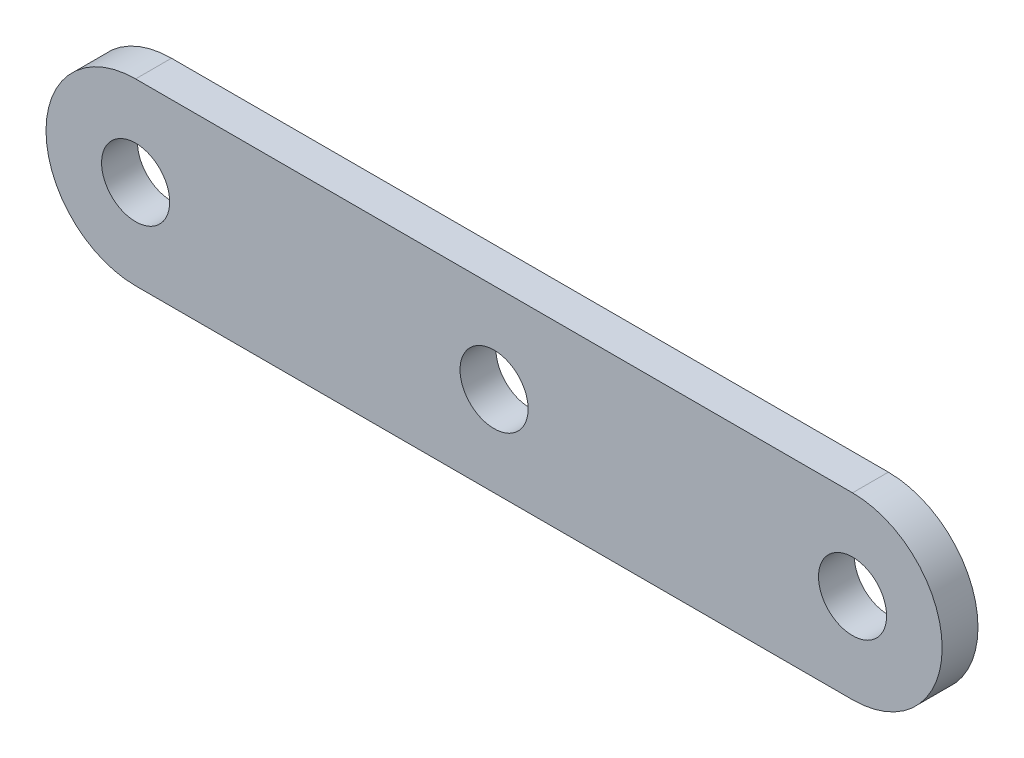
ISO-10303-21;
HEADER;
FILE_DESCRIPTION(('STEP AP214'),'2;1');
FILE_NAME('part.step','',(''),(''),'','','');
FILE_SCHEMA(('AUTOMOTIVE_DESIGN { 1 0 10303 214 1 1 1 1 }'));
ENDSEC;
DATA;
#1=APPLICATION_CONTEXT('core data for automotive mechanical design processes');
#2=APPLICATION_PROTOCOL_DEFINITION('international standard','automotive_design',2000,#1);
#3=PRODUCT_CONTEXT('',#1,'mechanical');
#4=PRODUCT('Part','Part','',(#3));
#5=PRODUCT_RELATED_PRODUCT_CATEGORY('part','',(#4));
#6=PRODUCT_DEFINITION_FORMATION('','',#4);
#7=PRODUCT_DEFINITION_CONTEXT('part definition',#1,'design');
#8=PRODUCT_DEFINITION('design','',#6,#7);
#9=PRODUCT_DEFINITION_SHAPE('','',#8);
#10=(LENGTH_UNIT() NAMED_UNIT(*) SI_UNIT(.MILLI.,.METRE.));
#11=(NAMED_UNIT(*) PLANE_ANGLE_UNIT() SI_UNIT($,.RADIAN.));
#12=(NAMED_UNIT(*) SI_UNIT($,.STERADIAN.) SOLID_ANGLE_UNIT());
#13=UNCERTAINTY_MEASURE_WITH_UNIT(LENGTH_MEASURE(1.E-05),#10,'distance_accuracy_value','');
#14=(GEOMETRIC_REPRESENTATION_CONTEXT(3) GLOBAL_UNCERTAINTY_ASSIGNED_CONTEXT((#13)) GLOBAL_UNIT_ASSIGNED_CONTEXT((#10,
#11,#12)) REPRESENTATION_CONTEXT('',''));
#15=CARTESIAN_POINT('',(0.,0.,0.));
#16=DIRECTION('',(0.,0.,1.));
#17=DIRECTION('',(1.,0.,0.));
#18=AXIS2_PLACEMENT_3D('',#15,#16,#17);
#19=CARTESIAN_POINT('',(-25.4,1.50874673629242,1.27));
#20=DIRECTION('',(0.,0.,1.));
#21=DIRECTION('',(1.,0.,0.));
#22=AXIS2_PLACEMENT_3D('',#19,#20,#21);
#23=PLANE('',#22);
#24=CARTESIAN_POINT('',(0.,1.50874673629242,1.27));
#25=DIRECTION('',(0.,0.,1.));
#26=DIRECTION('',(1.,0.,0.));
#27=AXIS2_PLACEMENT_3D('',#24,#25,#26);
#28=CIRCLE('',#27,2.413);
#29=CARTESIAN_POINT('',(2.413,1.50874673629242,1.27));
#30=VERTEX_POINT('',#29);
#31=EDGE_CURVE('E121',#30,#30,#28,.T.);
#32=ORIENTED_EDGE('',*,*,#31,.F.);
#33=EDGE_LOOP('',(#32));
#34=FACE_BOUND('',#33,.T.);
#35=CARTESIAN_POINT('',(-25.4,1.50874673629242,1.27));
#36=DIRECTION('',(0.,0.,1.));
#37=DIRECTION('',(1.,0.,0.));
#38=AXIS2_PLACEMENT_3D('',#35,#36,#37);
#39=CIRCLE('',#38,6.35);
#40=CARTESIAN_POINT('',(-25.4,7.85874673629242,1.27));
#41=VERTEX_POINT('',#40);
#42=CARTESIAN_POINT('',(-25.4,-4.84125326370757,1.27));
#43=VERTEX_POINT('',#42);
#44=EDGE_CURVE('E91',#41,#43,#39,.T.);
#45=ORIENTED_EDGE('',*,*,#44,.T.);
#46=DIRECTION('',(1.,0.,0.));
#47=VECTOR('',#46,1.);
#48=CARTESIAN_POINT('',(25.4,-4.84125326370757,1.27));
#49=LINE('',#48,#47);
#50=CARTESIAN_POINT('',(25.4,-4.84125326370757,1.27));
#51=VERTEX_POINT('',#50);
#52=EDGE_CURVE('E86',#43,#51,#49,.T.);
#53=ORIENTED_EDGE('',*,*,#52,.T.);
#54=CARTESIAN_POINT('',(25.4,1.50874673629243,1.27));
#55=DIRECTION('',(0.,0.,1.));
#56=DIRECTION('',(1.,0.,0.));
#57=AXIS2_PLACEMENT_3D('',#54,#55,#56);
#58=CIRCLE('',#57,6.35);
#59=CARTESIAN_POINT('',(25.4,7.85874673629242,1.27));
#60=VERTEX_POINT('',#59);
#61=EDGE_CURVE('E89',#51,#60,#58,.T.);
#62=ORIENTED_EDGE('',*,*,#61,.T.);
#63=DIRECTION('',(-1.,0.,0.));
#64=VECTOR('',#63,1.);
#65=CARTESIAN_POINT('',(25.4,7.85874673629242,1.27));
#66=LINE('',#65,#64);
#67=EDGE_CURVE('E56',#60,#41,#66,.T.);
#68=ORIENTED_EDGE('',*,*,#67,.T.);
#69=EDGE_LOOP('',(#45,#53,#62,#68));
#70=FACE_BOUND('',#69,.T.);
#71=CARTESIAN_POINT('',(-25.4,1.50874673629242,1.27));
#72=DIRECTION('',(0.,0.,1.));
#73=DIRECTION('',(1.,0.,0.));
#74=AXIS2_PLACEMENT_3D('',#71,#72,#73);
#75=CIRCLE('',#74,2.413);
#76=CARTESIAN_POINT('',(-22.987,1.50874673629242,1.27));
#77=VERTEX_POINT('',#76);
#78=EDGE_CURVE('E106',#77,#77,#75,.T.);
#79=ORIENTED_EDGE('',*,*,#78,.F.);
#80=EDGE_LOOP('',(#79));
#81=FACE_BOUND('',#80,.T.);
#82=CARTESIAN_POINT('',(25.4,1.50874673629243,1.27));
#83=DIRECTION('',(0.,0.,1.));
#84=DIRECTION('',(1.,0.,0.));
#85=AXIS2_PLACEMENT_3D('',#82,#83,#84);
#86=CIRCLE('',#85,2.413);
#87=CARTESIAN_POINT('',(27.813,1.50874673629243,1.27));
#88=VERTEX_POINT('',#87);
#89=EDGE_CURVE('E127',#88,#88,#86,.T.);
#90=ORIENTED_EDGE('',*,*,#89,.F.);
#91=EDGE_LOOP('',(#90));
#92=FACE_BOUND('',#91,.T.);
#93=ADVANCED_FACE('F39',(#34,#70,#81,#92),#23,.T.);
#94=CARTESIAN_POINT('',(-25.4,1.50874673629242,-1.27));
#95=DIRECTION('',(0.,0.,1.));
#96=DIRECTION('',(1.,0.,0.));
#97=AXIS2_PLACEMENT_3D('',#94,#95,#96);
#98=PLANE('',#97);
#99=CARTESIAN_POINT('',(-25.4,1.50874673629242,-1.27));
#100=DIRECTION('',(0.,0.,1.));
#101=DIRECTION('',(1.,0.,0.));
#102=AXIS2_PLACEMENT_3D('',#99,#100,#101);
#103=CIRCLE('',#102,6.35);
#104=CARTESIAN_POINT('',(-25.4,7.85874673629242,-1.27));
#105=VERTEX_POINT('',#104);
#106=CARTESIAN_POINT('',(-25.4,-4.84125326370757,-1.27));
#107=VERTEX_POINT('',#106);
#108=EDGE_CURVE('E103',#105,#107,#103,.T.);
#109=ORIENTED_EDGE('',*,*,#108,.F.);
#110=DIRECTION('',(-1.,0.,0.));
#111=VECTOR('',#110,1.);
#112=CARTESIAN_POINT('',(25.4,7.85874673629242,-1.27));
#113=LINE('',#112,#111);
#114=CARTESIAN_POINT('',(25.4,7.85874673629242,-1.27));
#115=VERTEX_POINT('',#114);
#116=EDGE_CURVE('E79',#115,#105,#113,.T.);
#117=ORIENTED_EDGE('',*,*,#116,.F.);
#118=CARTESIAN_POINT('',(25.4,1.50874673629243,-1.27));
#119=DIRECTION('',(0.,0.,1.));
#120=DIRECTION('',(1.,0.,0.));
#121=AXIS2_PLACEMENT_3D('',#118,#119,#120);
#122=CIRCLE('',#121,6.35);
#123=CARTESIAN_POINT('',(25.4,-4.84125326370757,-1.27));
#124=VERTEX_POINT('',#123);
#125=EDGE_CURVE('E73',#124,#115,#122,.T.);
#126=ORIENTED_EDGE('',*,*,#125,.F.);
#127=DIRECTION('',(1.,0.,0.));
#128=VECTOR('',#127,1.);
#129=CARTESIAN_POINT('',(25.4,-4.84125326370757,-1.27));
#130=LINE('',#129,#128);
#131=EDGE_CURVE('E95',#107,#124,#130,.T.);
#132=ORIENTED_EDGE('',*,*,#131,.F.);
#133=EDGE_LOOP('',(#109,#117,#126,#132));
#134=FACE_BOUND('',#133,.T.);
#135=CARTESIAN_POINT('',(-25.4,1.50874673629242,-1.27));
#136=DIRECTION('',(0.,0.,1.));
#137=DIRECTION('',(1.,0.,0.));
#138=AXIS2_PLACEMENT_3D('',#135,#136,#137);
#139=CIRCLE('',#138,2.413);
#140=CARTESIAN_POINT('',(-22.987,1.50874673629242,-1.27));
#141=VERTEX_POINT('',#140);
#142=EDGE_CURVE('E118',#141,#141,#139,.T.);
#143=ORIENTED_EDGE('',*,*,#142,.T.);
#144=EDGE_LOOP('',(#143));
#145=FACE_BOUND('',#144,.T.);
#146=CARTESIAN_POINT('',(0.,1.50874673629242,-1.27));
#147=DIRECTION('',(0.,0.,1.));
#148=DIRECTION('',(1.,0.,0.));
#149=AXIS2_PLACEMENT_3D('',#146,#147,#148);
#150=CIRCLE('',#149,2.413);
#151=CARTESIAN_POINT('',(2.413,1.50874673629242,-1.27));
#152=VERTEX_POINT('',#151);
#153=EDGE_CURVE('E124',#152,#152,#150,.T.);
#154=ORIENTED_EDGE('',*,*,#153,.T.);
#155=EDGE_LOOP('',(#154));
#156=FACE_BOUND('',#155,.T.);
#157=CARTESIAN_POINT('',(25.4,1.50874673629243,-1.27));
#158=DIRECTION('',(0.,0.,1.));
#159=DIRECTION('',(1.,0.,0.));
#160=AXIS2_PLACEMENT_3D('',#157,#158,#159);
#161=CIRCLE('',#160,2.413);
#162=CARTESIAN_POINT('',(27.813,1.50874673629243,-1.27));
#163=VERTEX_POINT('',#162);
#164=EDGE_CURVE('E130',#163,#163,#161,.T.);
#165=ORIENTED_EDGE('',*,*,#164,.T.);
#166=EDGE_LOOP('',(#165));
#167=FACE_BOUND('',#166,.T.);
#168=ADVANCED_FACE('F114',(#134,#145,#156,#167),#98,.F.);
#169=CARTESIAN_POINT('',(-25.4,1.50874673629242,1.27));
#170=DIRECTION('',(0.,0.,-1.));
#171=DIRECTION('',(-1.,0.,0.));
#172=AXIS2_PLACEMENT_3D('',#169,#170,#171);
#173=CYLINDRICAL_SURFACE('',#172,6.35);
#174=ORIENTED_EDGE('',*,*,#108,.T.);
#175=DIRECTION('',(0.,0.,-1.));
#176=VECTOR('',#175,1.);
#177=CARTESIAN_POINT('',(-25.4,-4.84125326370757,1.27));
#178=LINE('',#177,#176);
#179=EDGE_CURVE('E11',#43,#107,#178,.T.);
#180=ORIENTED_EDGE('',*,*,#179,.F.);
#181=ORIENTED_EDGE('',*,*,#44,.F.);
#182=DIRECTION('',(0.,0.,-1.));
#183=VECTOR('',#182,1.);
#184=CARTESIAN_POINT('',(-25.4,7.85874673629242,1.27));
#185=LINE('',#184,#183);
#186=EDGE_CURVE('E99',#41,#105,#185,.T.);
#187=ORIENTED_EDGE('',*,*,#186,.T.);
#188=EDGE_LOOP('',(#174,#180,#181,#187));
#189=FACE_BOUND('',#188,.T.);
#190=ADVANCED_FACE('F41',(#189),#173,.T.);
#191=CARTESIAN_POINT('',(25.4,-4.84125326370757,1.27));
#192=DIRECTION('',(0.,1.,0.));
#193=DIRECTION('',(0.,0.,1.));
#194=AXIS2_PLACEMENT_3D('',#191,#192,#193);
#195=PLANE('',#194);
#196=ORIENTED_EDGE('',*,*,#131,.T.);
#197=DIRECTION('',(0.,0.,-1.));
#198=VECTOR('',#197,1.);
#199=CARTESIAN_POINT('',(25.4,-4.84125326370757,1.27));
#200=LINE('',#199,#198);
#201=EDGE_CURVE('E48',#51,#124,#200,.T.);
#202=ORIENTED_EDGE('',*,*,#201,.F.);
#203=ORIENTED_EDGE('',*,*,#52,.F.);
#204=ORIENTED_EDGE('',*,*,#179,.T.);
#205=EDGE_LOOP('',(#196,#202,#203,#204));
#206=FACE_BOUND('',#205,.T.);
#207=ADVANCED_FACE('F94',(#206),#195,.F.);
#208=CARTESIAN_POINT('',(25.4,1.50874673629243,1.27));
#209=DIRECTION('',(0.,0.,-1.));
#210=DIRECTION('',(-1.,0.,0.));
#211=AXIS2_PLACEMENT_3D('',#208,#209,#210);
#212=CYLINDRICAL_SURFACE('',#211,6.35);
#213=ORIENTED_EDGE('',*,*,#125,.T.);
#214=DIRECTION('',(0.,0.,-1.));
#215=VECTOR('',#214,1.);
#216=CARTESIAN_POINT('',(25.4,7.85874673629242,1.27));
#217=LINE('',#216,#215);
#218=EDGE_CURVE('E96',#60,#115,#217,.T.);
#219=ORIENTED_EDGE('',*,*,#218,.F.);
#220=ORIENTED_EDGE('',*,*,#61,.F.);
#221=ORIENTED_EDGE('',*,*,#201,.T.);
#222=EDGE_LOOP('',(#213,#219,#220,#221));
#223=FACE_BOUND('',#222,.T.);
#224=ADVANCED_FACE('F97',(#223),#212,.T.);
#225=CARTESIAN_POINT('',(25.4,7.85874673629242,1.27));
#226=DIRECTION('',(0.,-1.,0.));
#227=DIRECTION('',(1.,0.,0.));
#228=AXIS2_PLACEMENT_3D('',#225,#226,#227);
#229=PLANE('',#228);
#230=ORIENTED_EDGE('',*,*,#116,.T.);
#231=ORIENTED_EDGE('',*,*,#186,.F.);
#232=ORIENTED_EDGE('',*,*,#67,.F.);
#233=ORIENTED_EDGE('',*,*,#218,.T.);
#234=EDGE_LOOP('',(#230,#231,#232,#233));
#235=FACE_BOUND('',#234,.T.);
#236=ADVANCED_FACE('F111',(#235),#229,.F.);
#237=CARTESIAN_POINT('',(-25.4,1.50874673629242,1.27));
#238=DIRECTION('',(0.,0.,-1.));
#239=DIRECTION('',(-1.,0.,0.));
#240=AXIS2_PLACEMENT_3D('',#237,#238,#239);
#241=CYLINDRICAL_SURFACE('',#240,2.413);
#242=ORIENTED_EDGE('',*,*,#78,.T.);
#243=EDGE_LOOP('',(#242));
#244=FACE_BOUND('',#243,.T.);
#245=ORIENTED_EDGE('',*,*,#142,.F.);
#246=EDGE_LOOP('',(#245));
#247=FACE_BOUND('',#246,.T.);
#248=ADVANCED_FACE('F148',(#244,#247),#241,.F.);
#249=CARTESIAN_POINT('',(0.,1.50874673629242,1.27));
#250=DIRECTION('',(0.,0.,-1.));
#251=DIRECTION('',(-1.,0.,0.));
#252=AXIS2_PLACEMENT_3D('',#249,#250,#251);
#253=CYLINDRICAL_SURFACE('',#252,2.413);
#254=ORIENTED_EDGE('',*,*,#31,.T.);
#255=EDGE_LOOP('',(#254));
#256=FACE_BOUND('',#255,.T.);
#257=ORIENTED_EDGE('',*,*,#153,.F.);
#258=EDGE_LOOP('',(#257));
#259=FACE_BOUND('',#258,.T.);
#260=ADVANCED_FACE('F193',(#256,#259),#253,.F.);
#261=CARTESIAN_POINT('',(25.4,1.50874673629243,1.27));
#262=DIRECTION('',(0.,0.,-1.));
#263=DIRECTION('',(-1.,0.,0.));
#264=AXIS2_PLACEMENT_3D('',#261,#262,#263);
#265=CYLINDRICAL_SURFACE('',#264,2.413);
#266=ORIENTED_EDGE('',*,*,#89,.T.);
#267=EDGE_LOOP('',(#266));
#268=FACE_BOUND('',#267,.T.);
#269=ORIENTED_EDGE('',*,*,#164,.F.);
#270=EDGE_LOOP('',(#269));
#271=FACE_BOUND('',#270,.T.);
#272=ADVANCED_FACE('F136',(#268,#271),#265,.F.);
#273=CLOSED_SHELL('',(#93,#168,#190,#207,#224,#236,#248,#260,#272));
#274=MANIFOLD_SOLID_BREP('B2',#273);
#275=ADVANCED_BREP_SHAPE_REPRESENTATION('',(#18,#274),#14);
#276=SHAPE_DEFINITION_REPRESENTATION(#9,#275);
ENDSEC;
END-ISO-10303-21;
